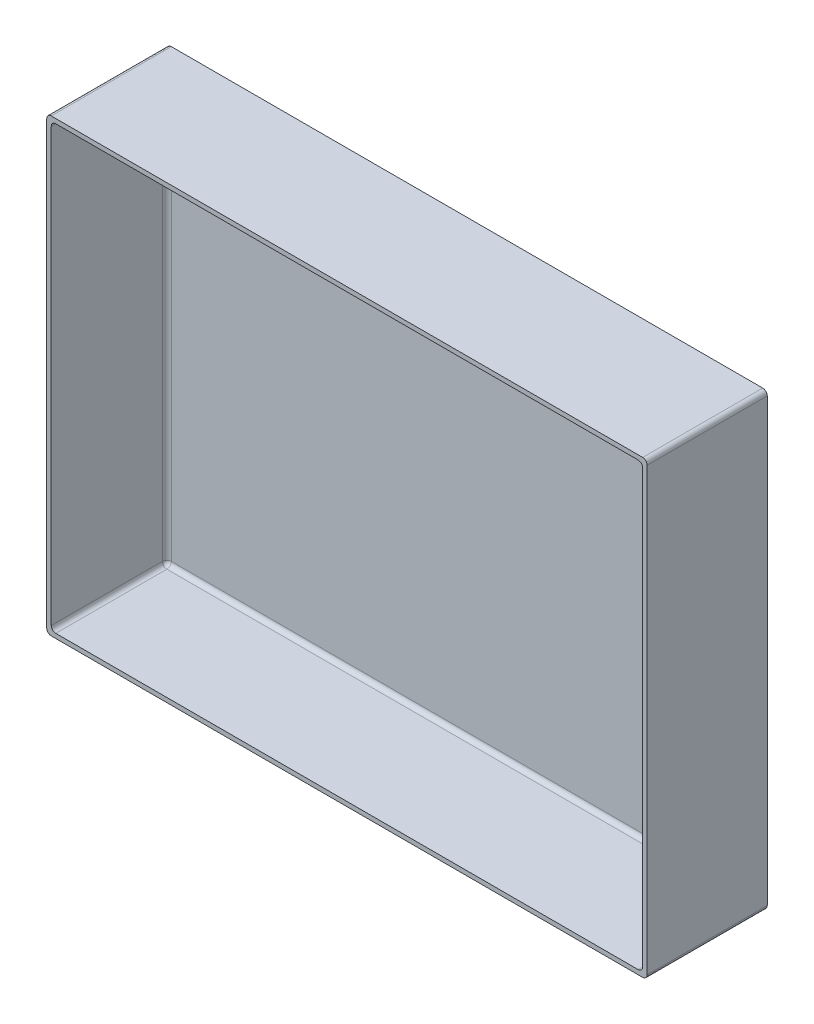
ISO-10303-21;
HEADER;
FILE_DESCRIPTION(('STEP AP214'),'2;1');
FILE_NAME('part.step','',(''),(''),'','','');
FILE_SCHEMA(('AUTOMOTIVE_DESIGN { 1 0 10303 214 1 1 1 1 }'));
ENDSEC;
DATA;
#1=APPLICATION_CONTEXT('core data for automotive mechanical design processes');
#2=APPLICATION_PROTOCOL_DEFINITION('international standard','automotive_design',2000,#1);
#3=PRODUCT_CONTEXT('',#1,'mechanical');
#4=PRODUCT('Part','Part','',(#3));
#5=PRODUCT_RELATED_PRODUCT_CATEGORY('part','',(#4));
#6=PRODUCT_DEFINITION_FORMATION('','',#4);
#7=PRODUCT_DEFINITION_CONTEXT('part definition',#1,'design');
#8=PRODUCT_DEFINITION('design','',#6,#7);
#9=PRODUCT_DEFINITION_SHAPE('','',#8);
#10=(LENGTH_UNIT() NAMED_UNIT(*) SI_UNIT(.MILLI.,.METRE.));
#11=(NAMED_UNIT(*) PLANE_ANGLE_UNIT() SI_UNIT($,.RADIAN.));
#12=(NAMED_UNIT(*) SI_UNIT($,.STERADIAN.) SOLID_ANGLE_UNIT());
#13=UNCERTAINTY_MEASURE_WITH_UNIT(LENGTH_MEASURE(1.E-05),#10,'distance_accuracy_value','');
#14=(GEOMETRIC_REPRESENTATION_CONTEXT(3) GLOBAL_UNCERTAINTY_ASSIGNED_CONTEXT((#13)) GLOBAL_UNIT_ASSIGNED_CONTEXT((#10,
#11,#12)) REPRESENTATION_CONTEXT('',''));
#15=CARTESIAN_POINT('',(0.,0.,0.));
#16=DIRECTION('',(0.,0.,1.));
#17=DIRECTION('',(1.,0.,0.));
#18=AXIS2_PLACEMENT_3D('',#15,#16,#17);
#19=CARTESIAN_POINT('',(0.,0.,80.));
#20=DIRECTION('',(0.,0.,-1.));
#21=DIRECTION('',(-1.,0.,0.));
#22=AXIS2_PLACEMENT_3D('',#19,#20,#21);
#23=PLANE('',#22);
#24=DIRECTION('',(1.,0.,0.));
#25=VECTOR('',#24,1.);
#26=CARTESIAN_POINT('',(-200.,-150.,80.));
#27=LINE('',#26,#25);
#28=CARTESIAN_POINT('',(-197.,-150.,80.));
#29=VERTEX_POINT('',#28);
#30=CARTESIAN_POINT('',(197.,-150.,80.));
#31=VERTEX_POINT('',#30);
#32=EDGE_CURVE('E182',#29,#31,#27,.T.);
#33=ORIENTED_EDGE('',*,*,#32,.T.);
#34=CARTESIAN_POINT('',(197.,-147.,80.));
#35=DIRECTION('',(0.,0.,-1.));
#36=DIRECTION('',(-1.,0.,0.));
#37=AXIS2_PLACEMENT_3D('',#34,#35,#36);
#38=CIRCLE('',#37,3.);
#39=CARTESIAN_POINT('',(200.,-147.,80.));
#40=VERTEX_POINT('',#39);
#41=EDGE_CURVE('E234',#31,#40,#38,.F.);
#42=ORIENTED_EDGE('',*,*,#41,.T.);
#43=DIRECTION('',(0.,1.,0.));
#44=VECTOR('',#43,1.);
#45=CARTESIAN_POINT('',(200.,-150.,80.));
#46=LINE('',#45,#44);
#47=CARTESIAN_POINT('',(200.,147.,80.));
#48=VERTEX_POINT('',#47);
#49=EDGE_CURVE('E266',#40,#48,#46,.T.);
#50=ORIENTED_EDGE('',*,*,#49,.T.);
#51=CARTESIAN_POINT('',(197.,147.,80.));
#52=DIRECTION('',(0.,0.,-1.));
#53=DIRECTION('',(-1.,0.,0.));
#54=AXIS2_PLACEMENT_3D('',#51,#52,#53);
#55=CIRCLE('',#54,3.);
#56=CARTESIAN_POINT('',(197.,150.,80.));
#57=VERTEX_POINT('',#56);
#58=EDGE_CURVE('E231',#48,#57,#55,.F.);
#59=ORIENTED_EDGE('',*,*,#58,.T.);
#60=DIRECTION('',(-1.,0.,0.));
#61=VECTOR('',#60,1.);
#62=CARTESIAN_POINT('',(-200.,150.,80.));
#63=LINE('',#62,#61);
#64=CARTESIAN_POINT('',(-197.,150.,80.));
#65=VERTEX_POINT('',#64);
#66=EDGE_CURVE('E248',#57,#65,#63,.T.);
#67=ORIENTED_EDGE('',*,*,#66,.T.);
#68=CARTESIAN_POINT('',(-197.,147.,80.));
#69=DIRECTION('',(0.,0.,-1.));
#70=DIRECTION('',(-1.,0.,0.));
#71=AXIS2_PLACEMENT_3D('',#68,#69,#70);
#72=CIRCLE('',#71,3.);
#73=CARTESIAN_POINT('',(-200.,147.,80.));
#74=VERTEX_POINT('',#73);
#75=EDGE_CURVE('E56',#65,#74,#72,.F.);
#76=ORIENTED_EDGE('',*,*,#75,.T.);
#77=DIRECTION('',(0.,-1.,0.));
#78=VECTOR('',#77,1.);
#79=CARTESIAN_POINT('',(-200.,-150.,80.));
#80=LINE('',#79,#78);
#81=CARTESIAN_POINT('',(-200.,-147.,80.));
#82=VERTEX_POINT('',#81);
#83=EDGE_CURVE('E363',#74,#82,#80,.T.);
#84=ORIENTED_EDGE('',*,*,#83,.T.);
#85=CARTESIAN_POINT('',(-197.,-147.,80.));
#86=DIRECTION('',(0.,0.,-1.));
#87=DIRECTION('',(-1.,0.,0.));
#88=AXIS2_PLACEMENT_3D('',#85,#86,#87);
#89=CIRCLE('',#88,3.);
#90=EDGE_CURVE('E229',#82,#29,#89,.F.);
#91=ORIENTED_EDGE('',*,*,#90,.T.);
#92=EDGE_LOOP('',(#33,#42,#50,#59,#67,#76,#84,#91));
#93=FACE_BOUND('',#92,.T.);
#94=DIRECTION('',(0.,1.,0.));
#95=VECTOR('',#94,1.);
#96=CARTESIAN_POINT('',(197.,0.,80.));
#97=LINE('',#96,#95);
#98=CARTESIAN_POINT('',(197.,-144.,80.));
#99=VERTEX_POINT('',#98);
#100=CARTESIAN_POINT('',(197.,144.,80.));
#101=VERTEX_POINT('',#100);
#102=EDGE_CURVE('E209',#99,#101,#97,.T.);
#103=ORIENTED_EDGE('',*,*,#102,.F.);
#104=CARTESIAN_POINT('',(194.,-144.,80.));
#105=DIRECTION('',(0.,0.,-1.));
#106=DIRECTION('',(-1.,0.,0.));
#107=AXIS2_PLACEMENT_3D('',#104,#105,#106);
#108=CIRCLE('',#107,3.);
#109=CARTESIAN_POINT('',(194.,-147.,80.));
#110=VERTEX_POINT('',#109);
#111=EDGE_CURVE('E294',#99,#110,#108,.T.);
#112=ORIENTED_EDGE('',*,*,#111,.T.);
#113=DIRECTION('',(1.,0.,0.));
#114=VECTOR('',#113,1.);
#115=CARTESIAN_POINT('',(0.,-147.,80.));
#116=LINE('',#115,#114);
#117=CARTESIAN_POINT('',(-194.,-147.,80.));
#118=VERTEX_POINT('',#117);
#119=EDGE_CURVE('E261',#118,#110,#116,.T.);
#120=ORIENTED_EDGE('',*,*,#119,.F.);
#121=CARTESIAN_POINT('',(-194.,-144.,80.));
#122=DIRECTION('',(0.,0.,-1.));
#123=DIRECTION('',(-1.,0.,0.));
#124=AXIS2_PLACEMENT_3D('',#121,#122,#123);
#125=CIRCLE('',#124,3.);
#126=CARTESIAN_POINT('',(-197.,-144.,80.));
#127=VERTEX_POINT('',#126);
#128=EDGE_CURVE('E296',#118,#127,#125,.T.);
#129=ORIENTED_EDGE('',*,*,#128,.T.);
#130=DIRECTION('',(0.,-1.,0.));
#131=VECTOR('',#130,1.);
#132=CARTESIAN_POINT('',(-197.,0.,80.));
#133=LINE('',#132,#131);
#134=CARTESIAN_POINT('',(-197.,144.,80.));
#135=VERTEX_POINT('',#134);
#136=EDGE_CURVE('E352',#135,#127,#133,.T.);
#137=ORIENTED_EDGE('',*,*,#136,.F.);
#138=CARTESIAN_POINT('',(-194.,144.,80.));
#139=DIRECTION('',(0.,0.,-1.));
#140=DIRECTION('',(-1.,0.,0.));
#141=AXIS2_PLACEMENT_3D('',#138,#139,#140);
#142=CIRCLE('',#141,3.);
#143=CARTESIAN_POINT('',(-194.,147.,80.));
#144=VERTEX_POINT('',#143);
#145=EDGE_CURVE('E298',#135,#144,#142,.T.);
#146=ORIENTED_EDGE('',*,*,#145,.T.);
#147=DIRECTION('',(-1.,0.,0.));
#148=VECTOR('',#147,1.);
#149=CARTESIAN_POINT('',(0.,147.,80.));
#150=LINE('',#149,#148);
#151=CARTESIAN_POINT('',(194.,147.,80.));
#152=VERTEX_POINT('',#151);
#153=EDGE_CURVE('E347',#152,#144,#150,.T.);
#154=ORIENTED_EDGE('',*,*,#153,.F.);
#155=CARTESIAN_POINT('',(194.,144.,80.));
#156=DIRECTION('',(0.,0.,-1.));
#157=DIRECTION('',(-1.,0.,0.));
#158=AXIS2_PLACEMENT_3D('',#155,#156,#157);
#159=CIRCLE('',#158,3.);
#160=EDGE_CURVE('E213',#152,#101,#159,.T.);
#161=ORIENTED_EDGE('',*,*,#160,.T.);
#162=EDGE_LOOP('',(#103,#112,#120,#129,#137,#146,#154,#161));
#163=FACE_BOUND('',#162,.T.);
#164=ADVANCED_FACE('F34',(#93,#163),#23,.F.);
#165=CARTESIAN_POINT('',(200.,-150.,80.));
#166=DIRECTION('',(-1.,0.,0.));
#167=DIRECTION('',(0.,0.,1.));
#168=AXIS2_PLACEMENT_3D('',#165,#166,#167);
#169=PLANE('',#168);
#170=ORIENTED_EDGE('',*,*,#49,.F.);
#171=DIRECTION('',(0.,0.,-1.));
#172=VECTOR('',#171,1.);
#173=CARTESIAN_POINT('',(200.,-147.,80.));
#174=LINE('',#173,#172);
#175=CARTESIAN_POINT('',(200.,-147.,0.));
#176=VERTEX_POINT('',#175);
#177=EDGE_CURVE('E212',#40,#176,#174,.T.);
#178=ORIENTED_EDGE('',*,*,#177,.T.);
#179=DIRECTION('',(0.,1.,0.));
#180=VECTOR('',#179,1.);
#181=CARTESIAN_POINT('',(200.,-150.,0.));
#182=LINE('',#181,#180);
#183=CARTESIAN_POINT('',(200.,147.,0.));
#184=VERTEX_POINT('',#183);
#185=EDGE_CURVE('E257',#176,#184,#182,.T.);
#186=ORIENTED_EDGE('',*,*,#185,.T.);
#187=DIRECTION('',(0.,0.,-1.));
#188=VECTOR('',#187,1.);
#189=CARTESIAN_POINT('',(200.,147.,80.));
#190=LINE('',#189,#188);
#191=EDGE_CURVE('E210',#184,#48,#190,.F.);
#192=ORIENTED_EDGE('',*,*,#191,.T.);
#193=EDGE_LOOP('',(#170,#178,#186,#192));
#194=FACE_BOUND('',#193,.T.);
#195=ADVANCED_FACE('F376',(#194),#169,.F.);
#196=CARTESIAN_POINT('',(-200.,150.,80.));
#197=DIRECTION('',(0.,-1.,0.));
#198=DIRECTION('',(0.,0.,-1.));
#199=AXIS2_PLACEMENT_3D('',#196,#197,#198);
#200=PLANE('',#199);
#201=DIRECTION('',(-1.,0.,0.));
#202=VECTOR('',#201,1.);
#203=CARTESIAN_POINT('',(-200.,150.,0.));
#204=LINE('',#203,#202);
#205=CARTESIAN_POINT('',(197.,150.,0.));
#206=VERTEX_POINT('',#205);
#207=CARTESIAN_POINT('',(-197.,150.,0.));
#208=VERTEX_POINT('',#207);
#209=EDGE_CURVE('E246',#206,#208,#204,.T.);
#210=ORIENTED_EDGE('',*,*,#209,.T.);
#211=DIRECTION('',(0.,0.,-1.));
#212=VECTOR('',#211,1.);
#213=CARTESIAN_POINT('',(-197.,150.,80.));
#214=LINE('',#213,#212);
#215=EDGE_CURVE('E11',#208,#65,#214,.F.);
#216=ORIENTED_EDGE('',*,*,#215,.T.);
#217=ORIENTED_EDGE('',*,*,#66,.F.);
#218=DIRECTION('',(0.,0.,-1.));
#219=VECTOR('',#218,1.);
#220=CARTESIAN_POINT('',(197.,150.,80.));
#221=LINE('',#220,#219);
#222=EDGE_CURVE('E42',#57,#206,#221,.T.);
#223=ORIENTED_EDGE('',*,*,#222,.T.);
#224=EDGE_LOOP('',(#210,#216,#217,#223));
#225=FACE_BOUND('',#224,.T.);
#226=ADVANCED_FACE('F245',(#225),#200,.F.);
#227=CARTESIAN_POINT('',(-200.,-150.,80.));
#228=DIRECTION('',(1.,0.,0.));
#229=DIRECTION('',(0.,0.,-1.));
#230=AXIS2_PLACEMENT_3D('',#227,#228,#229);
#231=PLANE('',#230);
#232=ORIENTED_EDGE('',*,*,#83,.F.);
#233=DIRECTION('',(0.,0.,-1.));
#234=VECTOR('',#233,1.);
#235=CARTESIAN_POINT('',(-200.,147.,80.));
#236=LINE('',#235,#234);
#237=CARTESIAN_POINT('',(-200.,147.,0.));
#238=VERTEX_POINT('',#237);
#239=EDGE_CURVE('E237',#74,#238,#236,.T.);
#240=ORIENTED_EDGE('',*,*,#239,.T.);
#241=DIRECTION('',(0.,-1.,0.));
#242=VECTOR('',#241,1.);
#243=CARTESIAN_POINT('',(-200.,-150.,0.));
#244=LINE('',#243,#242);
#245=CARTESIAN_POINT('',(-200.,-147.,0.));
#246=VERTEX_POINT('',#245);
#247=EDGE_CURVE('E256',#238,#246,#244,.T.);
#248=ORIENTED_EDGE('',*,*,#247,.T.);
#249=DIRECTION('',(0.,0.,-1.));
#250=VECTOR('',#249,1.);
#251=CARTESIAN_POINT('',(-200.,-147.,80.));
#252=LINE('',#251,#250);
#253=EDGE_CURVE('E49',#246,#82,#252,.F.);
#254=ORIENTED_EDGE('',*,*,#253,.T.);
#255=EDGE_LOOP('',(#232,#240,#248,#254));
#256=FACE_BOUND('',#255,.T.);
#257=ADVANCED_FACE('F381',(#256),#231,.F.);
#258=CARTESIAN_POINT('',(-200.,-150.,80.));
#259=DIRECTION('',(0.,1.,0.));
#260=DIRECTION('',(0.,0.,1.));
#261=AXIS2_PLACEMENT_3D('',#258,#259,#260);
#262=PLANE('',#261);
#263=DIRECTION('',(1.,0.,0.));
#264=VECTOR('',#263,1.);
#265=CARTESIAN_POINT('',(-200.,-150.,0.));
#266=LINE('',#265,#264);
#267=CARTESIAN_POINT('',(-197.,-150.,0.));
#268=VERTEX_POINT('',#267);
#269=CARTESIAN_POINT('',(197.,-150.,0.));
#270=VERTEX_POINT('',#269);
#271=EDGE_CURVE('E259',#268,#270,#266,.T.);
#272=ORIENTED_EDGE('',*,*,#271,.T.);
#273=DIRECTION('',(0.,0.,-1.));
#274=VECTOR('',#273,1.);
#275=CARTESIAN_POINT('',(197.,-150.,80.));
#276=LINE('',#275,#274);
#277=EDGE_CURVE('E227',#270,#31,#276,.F.);
#278=ORIENTED_EDGE('',*,*,#277,.T.);
#279=ORIENTED_EDGE('',*,*,#32,.F.);
#280=DIRECTION('',(0.,0.,-1.));
#281=VECTOR('',#280,1.);
#282=CARTESIAN_POINT('',(-197.,-150.,80.));
#283=LINE('',#282,#281);
#284=EDGE_CURVE('E224',#29,#268,#283,.T.);
#285=ORIENTED_EDGE('',*,*,#284,.T.);
#286=EDGE_LOOP('',(#272,#278,#279,#285));
#287=FACE_BOUND('',#286,.T.);
#288=ADVANCED_FACE('F379',(#287),#262,.F.);
#289=CARTESIAN_POINT('',(0.,0.,0.));
#290=DIRECTION('',(0.,0.,-1.));
#291=DIRECTION('',(-1.,0.,0.));
#292=AXIS2_PLACEMENT_3D('',#289,#290,#291);
#293=PLANE('',#292);
#294=ORIENTED_EDGE('',*,*,#185,.F.);
#295=CARTESIAN_POINT('',(197.,-147.,0.));
#296=DIRECTION('',(0.,0.,-1.));
#297=DIRECTION('',(-1.,0.,0.));
#298=AXIS2_PLACEMENT_3D('',#295,#296,#297);
#299=CIRCLE('',#298,3.);
#300=EDGE_CURVE('E222',#176,#270,#299,.T.);
#301=ORIENTED_EDGE('',*,*,#300,.T.);
#302=ORIENTED_EDGE('',*,*,#271,.F.);
#303=CARTESIAN_POINT('',(-197.,-147.,0.));
#304=DIRECTION('',(0.,0.,-1.));
#305=DIRECTION('',(-1.,0.,0.));
#306=AXIS2_PLACEMENT_3D('',#303,#304,#305);
#307=CIRCLE('',#306,3.);
#308=EDGE_CURVE('E216',#268,#246,#307,.T.);
#309=ORIENTED_EDGE('',*,*,#308,.T.);
#310=ORIENTED_EDGE('',*,*,#247,.F.);
#311=CARTESIAN_POINT('',(-197.,147.,0.));
#312=DIRECTION('',(0.,0.,-1.));
#313=DIRECTION('',(-1.,0.,0.));
#314=AXIS2_PLACEMENT_3D('',#311,#312,#313);
#315=CIRCLE('',#314,3.);
#316=EDGE_CURVE('E220',#238,#208,#315,.T.);
#317=ORIENTED_EDGE('',*,*,#316,.T.);
#318=ORIENTED_EDGE('',*,*,#209,.F.);
#319=CARTESIAN_POINT('',(197.,147.,0.));
#320=DIRECTION('',(0.,0.,-1.));
#321=DIRECTION('',(-1.,0.,0.));
#322=AXIS2_PLACEMENT_3D('',#319,#320,#321);
#323=CIRCLE('',#322,3.);
#324=EDGE_CURVE('E218',#206,#184,#323,.T.);
#325=ORIENTED_EDGE('',*,*,#324,.T.);
#326=EDGE_LOOP('',(#294,#301,#302,#309,#310,#317,#318,#325));
#327=FACE_BOUND('',#326,.T.);
#328=ADVANCED_FACE('F253',(#327),#293,.T.);
#329=CARTESIAN_POINT('',(197.,-150.,80.));
#330=DIRECTION('',(-1.,0.,0.));
#331=DIRECTION('',(0.,0.,1.));
#332=AXIS2_PLACEMENT_3D('',#329,#330,#331);
#333=PLANE('',#332);
#334=DIRECTION('',(0.,1.,0.));
#335=VECTOR('',#334,1.);
#336=CARTESIAN_POINT('',(197.,-150.,6.00000000000001));
#337=LINE('',#336,#335);
#338=CARTESIAN_POINT('',(197.,144.,6.));
#339=VERTEX_POINT('',#338);
#340=CARTESIAN_POINT('',(197.,-144.,6.));
#341=VERTEX_POINT('',#340);
#342=EDGE_CURVE('E272',#339,#341,#337,.F.);
#343=ORIENTED_EDGE('',*,*,#342,.T.);
#344=DIRECTION('',(0.,0.,-1.));
#345=VECTOR('',#344,1.);
#346=CARTESIAN_POINT('',(197.,-144.,80.));
#347=LINE('',#346,#345);
#348=EDGE_CURVE('E275',#341,#99,#347,.F.);
#349=ORIENTED_EDGE('',*,*,#348,.T.);
#350=ORIENTED_EDGE('',*,*,#102,.T.);
#351=DIRECTION('',(0.,0.,-1.));
#352=VECTOR('',#351,1.);
#353=CARTESIAN_POINT('',(197.,144.,3.));
#354=LINE('',#353,#352);
#355=EDGE_CURVE('E270',#101,#339,#354,.T.);
#356=ORIENTED_EDGE('',*,*,#355,.T.);
#357=EDGE_LOOP('',(#343,#349,#350,#356));
#358=FACE_BOUND('',#357,.T.);
#359=ADVANCED_FACE('F331',(#358),#333,.T.);
#360=CARTESIAN_POINT('',(-200.,147.,80.));
#361=DIRECTION('',(0.,-1.,0.));
#362=DIRECTION('',(0.,0.,-1.));
#363=AXIS2_PLACEMENT_3D('',#360,#361,#362);
#364=PLANE('',#363);
#365=ORIENTED_EDGE('',*,*,#153,.T.);
#366=DIRECTION('',(0.,0.,-1.));
#367=VECTOR('',#366,1.);
#368=CARTESIAN_POINT('',(-194.,147.,3.));
#369=LINE('',#368,#367);
#370=CARTESIAN_POINT('',(-194.,147.,6.));
#371=VERTEX_POINT('',#370);
#372=EDGE_CURVE('E280',#144,#371,#369,.T.);
#373=ORIENTED_EDGE('',*,*,#372,.T.);
#374=DIRECTION('',(-1.,0.,0.));
#375=VECTOR('',#374,1.);
#376=CARTESIAN_POINT('',(-200.,147.,6.00000000000001));
#377=LINE('',#376,#375);
#378=CARTESIAN_POINT('',(194.,147.,6.));
#379=VERTEX_POINT('',#378);
#380=EDGE_CURVE('E193',#371,#379,#377,.F.);
#381=ORIENTED_EDGE('',*,*,#380,.T.);
#382=DIRECTION('',(0.,0.,-1.));
#383=VECTOR('',#382,1.);
#384=CARTESIAN_POINT('',(194.,147.,80.));
#385=LINE('',#384,#383);
#386=EDGE_CURVE('E277',#379,#152,#385,.F.);
#387=ORIENTED_EDGE('',*,*,#386,.T.);
#388=EDGE_LOOP('',(#365,#373,#381,#387));
#389=FACE_BOUND('',#388,.T.);
#390=ADVANCED_FACE('F346',(#389),#364,.T.);
#391=CARTESIAN_POINT('',(-197.,-150.,80.));
#392=DIRECTION('',(1.,0.,0.));
#393=DIRECTION('',(0.,0.,-1.));
#394=AXIS2_PLACEMENT_3D('',#391,#392,#393);
#395=PLANE('',#394);
#396=ORIENTED_EDGE('',*,*,#136,.T.);
#397=DIRECTION('',(0.,0.,-1.));
#398=VECTOR('',#397,1.);
#399=CARTESIAN_POINT('',(-197.,-144.,3.));
#400=LINE('',#399,#398);
#401=CARTESIAN_POINT('',(-197.,-144.,6.));
#402=VERTEX_POINT('',#401);
#403=EDGE_CURVE('E292',#127,#402,#400,.T.);
#404=ORIENTED_EDGE('',*,*,#403,.T.);
#405=DIRECTION('',(0.,-1.,0.));
#406=VECTOR('',#405,1.);
#407=CARTESIAN_POINT('',(-197.,-150.,6.00000000000001));
#408=LINE('',#407,#406);
#409=CARTESIAN_POINT('',(-197.,144.,6.));
#410=VERTEX_POINT('',#409);
#411=EDGE_CURVE('E288',#402,#410,#408,.F.);
#412=ORIENTED_EDGE('',*,*,#411,.T.);
#413=DIRECTION('',(0.,0.,-1.));
#414=VECTOR('',#413,1.);
#415=CARTESIAN_POINT('',(-197.,144.,80.));
#416=LINE('',#415,#414);
#417=EDGE_CURVE('E290',#410,#135,#416,.F.);
#418=ORIENTED_EDGE('',*,*,#417,.T.);
#419=EDGE_LOOP('',(#396,#404,#412,#418));
#420=FACE_BOUND('',#419,.T.);
#421=ADVANCED_FACE('F537',(#420),#395,.T.);
#422=CARTESIAN_POINT('',(-200.,-147.,80.));
#423=DIRECTION('',(0.,1.,0.));
#424=DIRECTION('',(0.,0.,1.));
#425=AXIS2_PLACEMENT_3D('',#422,#423,#424);
#426=PLANE('',#425);
#427=ORIENTED_EDGE('',*,*,#119,.T.);
#428=DIRECTION('',(0.,0.,-1.));
#429=VECTOR('',#428,1.);
#430=CARTESIAN_POINT('',(194.,-147.,3.));
#431=LINE('',#430,#429);
#432=CARTESIAN_POINT('',(194.,-147.,6.));
#433=VERTEX_POINT('',#432);
#434=EDGE_CURVE('E286',#110,#433,#431,.T.);
#435=ORIENTED_EDGE('',*,*,#434,.T.);
#436=DIRECTION('',(1.,0.,0.));
#437=VECTOR('',#436,1.);
#438=CARTESIAN_POINT('',(-200.,-147.,6.00000000000001));
#439=LINE('',#438,#437);
#440=CARTESIAN_POINT('',(-194.,-147.,6.));
#441=VERTEX_POINT('',#440);
#442=EDGE_CURVE('E284',#433,#441,#439,.F.);
#443=ORIENTED_EDGE('',*,*,#442,.T.);
#444=DIRECTION('',(0.,0.,-1.));
#445=VECTOR('',#444,1.);
#446=CARTESIAN_POINT('',(-194.,-147.,80.));
#447=LINE('',#446,#445);
#448=EDGE_CURVE('E282',#441,#118,#447,.F.);
#449=ORIENTED_EDGE('',*,*,#448,.T.);
#450=EDGE_LOOP('',(#427,#435,#443,#449));
#451=FACE_BOUND('',#450,.T.);
#452=ADVANCED_FACE('F530',(#451),#426,.T.);
#453=CARTESIAN_POINT('',(0.,0.,3.));
#454=DIRECTION('',(0.,0.,-1.));
#455=DIRECTION('',(-1.,0.,0.));
#456=AXIS2_PLACEMENT_3D('',#453,#454,#455);
#457=PLANE('',#456);
#458=DIRECTION('',(1.,0.,0.));
#459=VECTOR('',#458,1.);
#460=CARTESIAN_POINT('',(0.,-144.,3.));
#461=LINE('',#460,#459);
#462=CARTESIAN_POINT('',(-194.,-144.,3.));
#463=VERTEX_POINT('',#462);
#464=CARTESIAN_POINT('',(194.,-144.,3.));
#465=VERTEX_POINT('',#464);
#466=EDGE_CURVE('E170',#463,#465,#461,.T.);
#467=ORIENTED_EDGE('',*,*,#466,.T.);
#468=DIRECTION('',(0.,1.,0.));
#469=VECTOR('',#468,1.);
#470=CARTESIAN_POINT('',(194.,0.,3.));
#471=LINE('',#470,#469);
#472=CARTESIAN_POINT('',(194.,144.,3.));
#473=VERTEX_POINT('',#472);
#474=EDGE_CURVE('E166',#465,#473,#471,.T.);
#475=ORIENTED_EDGE('',*,*,#474,.T.);
#476=DIRECTION('',(-1.,0.,0.));
#477=VECTOR('',#476,1.);
#478=CARTESIAN_POINT('',(0.,144.,3.));
#479=LINE('',#478,#477);
#480=CARTESIAN_POINT('',(-194.,144.,3.));
#481=VERTEX_POINT('',#480);
#482=EDGE_CURVE('E160',#473,#481,#479,.T.);
#483=ORIENTED_EDGE('',*,*,#482,.T.);
#484=DIRECTION('',(0.,-1.,0.));
#485=VECTOR('',#484,1.);
#486=CARTESIAN_POINT('',(-194.,0.,3.));
#487=LINE('',#486,#485);
#488=EDGE_CURVE('E163',#481,#463,#487,.T.);
#489=ORIENTED_EDGE('',*,*,#488,.T.);
#490=EDGE_LOOP('',(#467,#475,#483,#489));
#491=FACE_BOUND('',#490,.T.);
#492=ADVANCED_FACE('F162',(#491),#457,.F.);
#493=CARTESIAN_POINT('',(-194.,-144.,80.));
#494=DIRECTION('',(0.,0.,1.));
#495=DIRECTION('',(1.,0.,0.));
#496=AXIS2_PLACEMENT_3D('',#493,#494,#495);
#497=CYLINDRICAL_SURFACE('',#496,3.);
#498=ORIENTED_EDGE('',*,*,#128,.F.);
#499=ORIENTED_EDGE('',*,*,#448,.F.);
#500=CARTESIAN_POINT('',(-194.,-144.,6.));
#501=DIRECTION('',(0.,0.,1.));
#502=DIRECTION('',(1.,0.,0.));
#503=AXIS2_PLACEMENT_3D('',#500,#501,#502);
#504=CIRCLE('',#503,3.);
#505=EDGE_CURVE('E206',#402,#441,#504,.T.);
#506=ORIENTED_EDGE('',*,*,#505,.F.);
#507=ORIENTED_EDGE('',*,*,#403,.F.);
#508=EDGE_LOOP('',(#498,#499,#506,#507));
#509=FACE_BOUND('',#508,.T.);
#510=ADVANCED_FACE('F435',(#509),#497,.F.);
#511=CARTESIAN_POINT('',(-194.,0.,6.));
#512=DIRECTION('',(0.,-1.,0.));
#513=DIRECTION('',(0.,0.,-1.));
#514=AXIS2_PLACEMENT_3D('',#511,#512,#513);
#515=CYLINDRICAL_SURFACE('',#514,3.);
#516=CARTESIAN_POINT('',(-194.,144.,6.));
#517=DIRECTION('',(0.,-1.,0.));
#518=DIRECTION('',(0.,0.,-1.));
#519=AXIS2_PLACEMENT_3D('',#516,#517,#518);
#520=CIRCLE('',#519,3.);
#521=EDGE_CURVE('E177',#410,#481,#520,.T.);
#522=ORIENTED_EDGE('',*,*,#521,.F.);
#523=ORIENTED_EDGE('',*,*,#411,.F.);
#524=CARTESIAN_POINT('',(-194.,-144.,6.));
#525=DIRECTION('',(0.,1.,0.));
#526=DIRECTION('',(0.,0.,1.));
#527=AXIS2_PLACEMENT_3D('',#524,#525,#526);
#528=CIRCLE('',#527,3.);
#529=EDGE_CURVE('E180',#463,#402,#528,.T.);
#530=ORIENTED_EDGE('',*,*,#529,.F.);
#531=ORIENTED_EDGE('',*,*,#488,.F.);
#532=EDGE_LOOP('',(#522,#523,#530,#531));
#533=FACE_BOUND('',#532,.T.);
#534=ADVANCED_FACE('F175',(#533),#515,.F.);
#535=CARTESIAN_POINT('',(-194.,144.,80.));
#536=DIRECTION('',(0.,0.,1.));
#537=DIRECTION('',(1.,0.,0.));
#538=AXIS2_PLACEMENT_3D('',#535,#536,#537);
#539=CYLINDRICAL_SURFACE('',#538,3.);
#540=ORIENTED_EDGE('',*,*,#145,.F.);
#541=ORIENTED_EDGE('',*,*,#417,.F.);
#542=CARTESIAN_POINT('',(-194.,144.,6.));
#543=DIRECTION('',(0.,0.,1.));
#544=DIRECTION('',(1.,0.,0.));
#545=AXIS2_PLACEMENT_3D('',#542,#543,#544);
#546=CIRCLE('',#545,3.);
#547=EDGE_CURVE('E190',#371,#410,#546,.T.);
#548=ORIENTED_EDGE('',*,*,#547,.F.);
#549=ORIENTED_EDGE('',*,*,#372,.F.);
#550=EDGE_LOOP('',(#540,#541,#548,#549));
#551=FACE_BOUND('',#550,.T.);
#552=ADVANCED_FACE('F428',(#551),#539,.F.);
#553=CARTESIAN_POINT('',(-194.,-144.,6.));
#554=DIRECTION('',(0.,0.,1.));
#555=DIRECTION('',(1.,0.,0.));
#556=AXIS2_PLACEMENT_3D('',#553,#554,#555);
#557=SPHERICAL_SURFACE('',#556,3.);
#558=ORIENTED_EDGE('',*,*,#529,.T.);
#559=ORIENTED_EDGE('',*,*,#505,.T.);
#560=CARTESIAN_POINT('',(-194.,-144.,6.));
#561=DIRECTION('',(1.,0.,0.));
#562=DIRECTION('',(0.,0.,-1.));
#563=AXIS2_PLACEMENT_3D('',#560,#561,#562);
#564=CIRCLE('',#563,3.);
#565=EDGE_CURVE('E194',#463,#441,#564,.F.);
#566=ORIENTED_EDGE('',*,*,#565,.F.);
#567=EDGE_LOOP('',(#558,#559,#566));
#568=FACE_BOUND('',#567,.T.);
#569=ADVANCED_FACE('F425',(#568),#557,.F.);
#570=CARTESIAN_POINT('',(-194.,144.,6.));
#571=DIRECTION('',(0.,0.,1.));
#572=DIRECTION('',(1.,0.,0.));
#573=AXIS2_PLACEMENT_3D('',#570,#571,#572);
#574=SPHERICAL_SURFACE('',#573,3.);
#575=ORIENTED_EDGE('',*,*,#547,.T.);
#576=ORIENTED_EDGE('',*,*,#521,.T.);
#577=CARTESIAN_POINT('',(-194.,144.,6.));
#578=DIRECTION('',(1.,0.,0.));
#579=DIRECTION('',(0.,0.,-1.));
#580=AXIS2_PLACEMENT_3D('',#577,#578,#579);
#581=CIRCLE('',#580,3.);
#582=EDGE_CURVE('E187',#371,#481,#581,.F.);
#583=ORIENTED_EDGE('',*,*,#582,.F.);
#584=EDGE_LOOP('',(#575,#576,#583));
#585=FACE_BOUND('',#584,.T.);
#586=ADVANCED_FACE('F186',(#585),#574,.F.);
#587=CARTESIAN_POINT('',(194.,-144.,80.));
#588=DIRECTION('',(0.,0.,1.));
#589=DIRECTION('',(1.,0.,0.));
#590=AXIS2_PLACEMENT_3D('',#587,#588,#589);
#591=CYLINDRICAL_SURFACE('',#590,3.);
#592=ORIENTED_EDGE('',*,*,#111,.F.);
#593=ORIENTED_EDGE('',*,*,#348,.F.);
#594=CARTESIAN_POINT('',(194.,-144.,6.));
#595=DIRECTION('',(0.,0.,1.));
#596=DIRECTION('',(1.,0.,0.));
#597=AXIS2_PLACEMENT_3D('',#594,#595,#596);
#598=CIRCLE('',#597,3.);
#599=EDGE_CURVE('E195',#433,#341,#598,.T.);
#600=ORIENTED_EDGE('',*,*,#599,.F.);
#601=ORIENTED_EDGE('',*,*,#434,.F.);
#602=EDGE_LOOP('',(#592,#593,#600,#601));
#603=FACE_BOUND('',#602,.T.);
#604=ADVANCED_FACE('F326',(#603),#591,.F.);
#605=CARTESIAN_POINT('',(0.,-144.,6.));
#606=DIRECTION('',(1.,0.,0.));
#607=DIRECTION('',(0.,0.,-1.));
#608=AXIS2_PLACEMENT_3D('',#605,#606,#607);
#609=CYLINDRICAL_SURFACE('',#608,3.);
#610=ORIENTED_EDGE('',*,*,#565,.T.);
#611=ORIENTED_EDGE('',*,*,#442,.F.);
#612=CARTESIAN_POINT('',(194.,-144.,6.));
#613=DIRECTION('',(-1.,0.,0.));
#614=DIRECTION('',(0.,0.,1.));
#615=AXIS2_PLACEMENT_3D('',#612,#613,#614);
#616=CIRCLE('',#615,3.);
#617=EDGE_CURVE('E200',#465,#433,#616,.T.);
#618=ORIENTED_EDGE('',*,*,#617,.F.);
#619=ORIENTED_EDGE('',*,*,#466,.F.);
#620=EDGE_LOOP('',(#610,#611,#618,#619));
#621=FACE_BOUND('',#620,.T.);
#622=ADVANCED_FACE('F320',(#621),#609,.F.);
#623=CARTESIAN_POINT('',(0.,144.,6.));
#624=DIRECTION('',(-1.,0.,0.));
#625=DIRECTION('',(0.,0.,1.));
#626=AXIS2_PLACEMENT_3D('',#623,#624,#625);
#627=CYLINDRICAL_SURFACE('',#626,3.);
#628=ORIENTED_EDGE('',*,*,#582,.T.);
#629=ORIENTED_EDGE('',*,*,#482,.F.);
#630=CARTESIAN_POINT('',(194.,144.,6.));
#631=DIRECTION('',(-1.,0.,0.));
#632=DIRECTION('',(0.,0.,1.));
#633=AXIS2_PLACEMENT_3D('',#630,#631,#632);
#634=CIRCLE('',#633,3.);
#635=EDGE_CURVE('E308',#379,#473,#634,.T.);
#636=ORIENTED_EDGE('',*,*,#635,.F.);
#637=ORIENTED_EDGE('',*,*,#380,.F.);
#638=EDGE_LOOP('',(#628,#629,#636,#637));
#639=FACE_BOUND('',#638,.T.);
#640=ADVANCED_FACE('F192',(#639),#627,.F.);
#641=CARTESIAN_POINT('',(194.,144.,80.));
#642=DIRECTION('',(0.,0.,1.));
#643=DIRECTION('',(1.,0.,0.));
#644=AXIS2_PLACEMENT_3D('',#641,#642,#643);
#645=CYLINDRICAL_SURFACE('',#644,3.);
#646=ORIENTED_EDGE('',*,*,#160,.F.);
#647=ORIENTED_EDGE('',*,*,#386,.F.);
#648=CARTESIAN_POINT('',(194.,144.,6.));
#649=DIRECTION('',(0.,0.,1.));
#650=DIRECTION('',(1.,0.,0.));
#651=AXIS2_PLACEMENT_3D('',#648,#649,#650);
#652=CIRCLE('',#651,3.);
#653=EDGE_CURVE('E305',#339,#379,#652,.T.);
#654=ORIENTED_EDGE('',*,*,#653,.F.);
#655=ORIENTED_EDGE('',*,*,#355,.F.);
#656=EDGE_LOOP('',(#646,#647,#654,#655));
#657=FACE_BOUND('',#656,.T.);
#658=ADVANCED_FACE('F342',(#657),#645,.F.);
#659=CARTESIAN_POINT('',(194.,-144.,6.));
#660=DIRECTION('',(0.,0.,1.));
#661=DIRECTION('',(1.,0.,0.));
#662=AXIS2_PLACEMENT_3D('',#659,#660,#661);
#663=SPHERICAL_SURFACE('',#662,3.);
#664=ORIENTED_EDGE('',*,*,#617,.T.);
#665=ORIENTED_EDGE('',*,*,#599,.T.);
#666=CARTESIAN_POINT('',(194.,-144.,6.));
#667=DIRECTION('',(0.,1.,0.));
#668=DIRECTION('',(0.,0.,1.));
#669=AXIS2_PLACEMENT_3D('',#666,#667,#668);
#670=CIRCLE('',#669,3.);
#671=EDGE_CURVE('E303',#465,#341,#670,.F.);
#672=ORIENTED_EDGE('',*,*,#671,.F.);
#673=EDGE_LOOP('',(#664,#665,#672));
#674=FACE_BOUND('',#673,.T.);
#675=ADVANCED_FACE('F314',(#674),#663,.F.);
#676=CARTESIAN_POINT('',(194.,144.,6.));
#677=DIRECTION('',(0.,0.,1.));
#678=DIRECTION('',(1.,0.,0.));
#679=AXIS2_PLACEMENT_3D('',#676,#677,#678);
#680=SPHERICAL_SURFACE('',#679,3.);
#681=ORIENTED_EDGE('',*,*,#653,.T.);
#682=ORIENTED_EDGE('',*,*,#635,.T.);
#683=CARTESIAN_POINT('',(194.,144.,6.));
#684=DIRECTION('',(0.,-1.,0.));
#685=DIRECTION('',(0.,0.,-1.));
#686=AXIS2_PLACEMENT_3D('',#683,#684,#685);
#687=CIRCLE('',#686,3.);
#688=EDGE_CURVE('E301',#339,#473,#687,.F.);
#689=ORIENTED_EDGE('',*,*,#688,.F.);
#690=EDGE_LOOP('',(#681,#682,#689));
#691=FACE_BOUND('',#690,.T.);
#692=ADVANCED_FACE('F338',(#691),#680,.F.);
#693=CARTESIAN_POINT('',(194.,0.,6.));
#694=DIRECTION('',(0.,1.,0.));
#695=DIRECTION('',(0.,0.,1.));
#696=AXIS2_PLACEMENT_3D('',#693,#694,#695);
#697=CYLINDRICAL_SURFACE('',#696,3.);
#698=ORIENTED_EDGE('',*,*,#671,.T.);
#699=ORIENTED_EDGE('',*,*,#342,.F.);
#700=ORIENTED_EDGE('',*,*,#688,.T.);
#701=ORIENTED_EDGE('',*,*,#474,.F.);
#702=EDGE_LOOP('',(#698,#699,#700,#701));
#703=FACE_BOUND('',#702,.T.);
#704=ADVANCED_FACE('F336',(#703),#697,.F.);
#705=CARTESIAN_POINT('',(197.,-147.,80.));
#706=DIRECTION('',(0.,0.,-1.));
#707=DIRECTION('',(-1.,0.,0.));
#708=AXIS2_PLACEMENT_3D('',#705,#706,#707);
#709=CYLINDRICAL_SURFACE('',#708,3.);
#710=ORIENTED_EDGE('',*,*,#41,.F.);
#711=ORIENTED_EDGE('',*,*,#277,.F.);
#712=ORIENTED_EDGE('',*,*,#300,.F.);
#713=ORIENTED_EDGE('',*,*,#177,.F.);
#714=EDGE_LOOP('',(#710,#711,#712,#713));
#715=FACE_BOUND('',#714,.T.);
#716=ADVANCED_FACE('F374',(#715),#709,.T.);
#717=CARTESIAN_POINT('',(-197.,147.,80.));
#718=DIRECTION('',(0.,0.,-1.));
#719=DIRECTION('',(-1.,0.,0.));
#720=AXIS2_PLACEMENT_3D('',#717,#718,#719);
#721=CYLINDRICAL_SURFACE('',#720,3.);
#722=ORIENTED_EDGE('',*,*,#75,.F.);
#723=ORIENTED_EDGE('',*,*,#215,.F.);
#724=ORIENTED_EDGE('',*,*,#316,.F.);
#725=ORIENTED_EDGE('',*,*,#239,.F.);
#726=EDGE_LOOP('',(#722,#723,#724,#725));
#727=FACE_BOUND('',#726,.T.);
#728=ADVANCED_FACE('F384',(#727),#721,.T.);
#729=CARTESIAN_POINT('',(197.,147.,80.));
#730=DIRECTION('',(0.,0.,-1.));
#731=DIRECTION('',(-1.,0.,0.));
#732=AXIS2_PLACEMENT_3D('',#729,#730,#731);
#733=CYLINDRICAL_SURFACE('',#732,3.);
#734=ORIENTED_EDGE('',*,*,#58,.F.);
#735=ORIENTED_EDGE('',*,*,#191,.F.);
#736=ORIENTED_EDGE('',*,*,#324,.F.);
#737=ORIENTED_EDGE('',*,*,#222,.F.);
#738=EDGE_LOOP('',(#734,#735,#736,#737));
#739=FACE_BOUND('',#738,.T.);
#740=ADVANCED_FACE('F385',(#739),#733,.T.);
#741=CARTESIAN_POINT('',(-197.,-147.,80.));
#742=DIRECTION('',(0.,0.,-1.));
#743=DIRECTION('',(-1.,0.,0.));
#744=AXIS2_PLACEMENT_3D('',#741,#742,#743);
#745=CYLINDRICAL_SURFACE('',#744,3.);
#746=ORIENTED_EDGE('',*,*,#90,.F.);
#747=ORIENTED_EDGE('',*,*,#253,.F.);
#748=ORIENTED_EDGE('',*,*,#308,.F.);
#749=ORIENTED_EDGE('',*,*,#284,.F.);
#750=EDGE_LOOP('',(#746,#747,#748,#749));
#751=FACE_BOUND('',#750,.T.);
#752=ADVANCED_FACE('F36',(#751),#745,.T.);
#753=CLOSED_SHELL('',(#164,#195,#226,#257,#288,#328,#359,#390,#421,#452,#492,#510,#534,#552,
#569,#586,#604,#622,#640,#658,#675,#692,#704,#716,#728,#740,#752));
#754=MANIFOLD_SOLID_BREP('B2',#753);
#755=ADVANCED_BREP_SHAPE_REPRESENTATION('',(#18,#754),#14);
#756=SHAPE_DEFINITION_REPRESENTATION(#9,#755);
ENDSEC;
END-ISO-10303-21;
